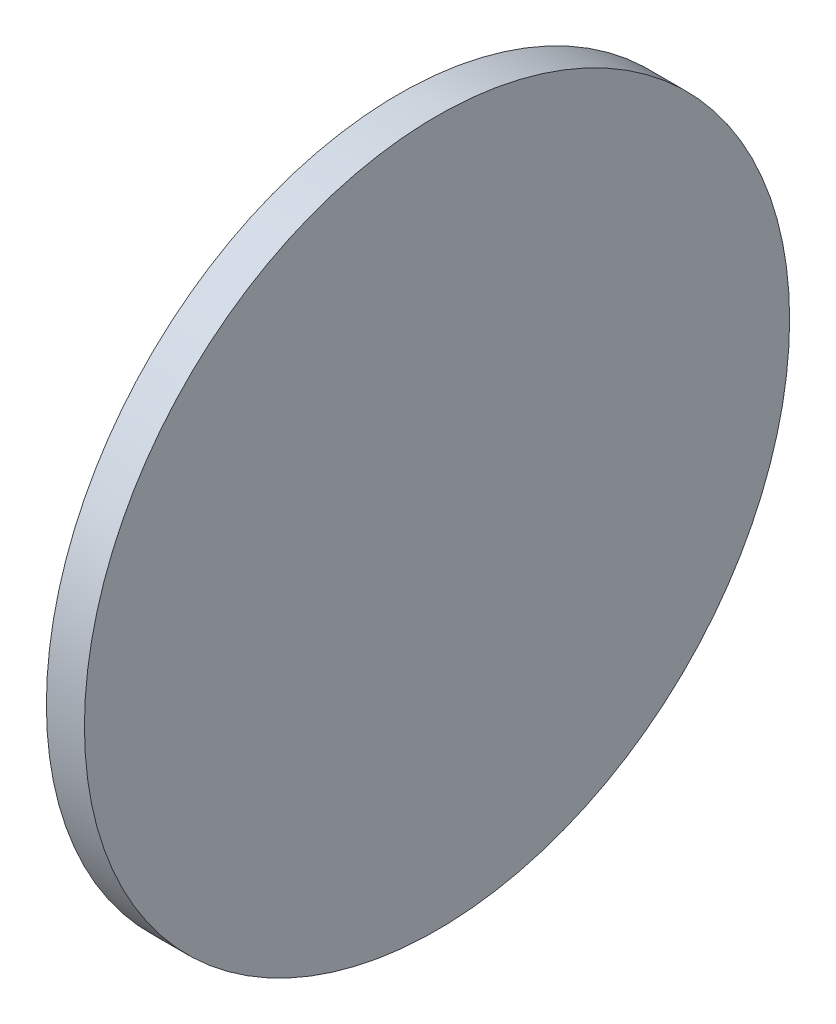
ISO-10303-21;
HEADER;
FILE_DESCRIPTION(('STEP AP214'),'2;1');
FILE_NAME('part.step','',(''),(''),'','','');
FILE_SCHEMA(('AUTOMOTIVE_DESIGN { 1 0 10303 214 1 1 1 1 }'));
ENDSEC;
DATA;
#1=APPLICATION_CONTEXT('core data for automotive mechanical design processes');
#2=APPLICATION_PROTOCOL_DEFINITION('international standard','automotive_design',2000,#1);
#3=PRODUCT_CONTEXT('',#1,'mechanical');
#4=PRODUCT('Part','Part','',(#3));
#5=PRODUCT_RELATED_PRODUCT_CATEGORY('part','',(#4));
#6=PRODUCT_DEFINITION_FORMATION('','',#4);
#7=PRODUCT_DEFINITION_CONTEXT('part definition',#1,'design');
#8=PRODUCT_DEFINITION('design','',#6,#7);
#9=PRODUCT_DEFINITION_SHAPE('','',#8);
#10=(LENGTH_UNIT() NAMED_UNIT(*) SI_UNIT(.MILLI.,.METRE.));
#11=(NAMED_UNIT(*) PLANE_ANGLE_UNIT() SI_UNIT($,.RADIAN.));
#12=(NAMED_UNIT(*) SI_UNIT($,.STERADIAN.) SOLID_ANGLE_UNIT());
#13=UNCERTAINTY_MEASURE_WITH_UNIT(LENGTH_MEASURE(1.E-05),#10,'distance_accuracy_value','');
#14=(GEOMETRIC_REPRESENTATION_CONTEXT(3) GLOBAL_UNCERTAINTY_ASSIGNED_CONTEXT((#13)) GLOBAL_UNIT_ASSIGNED_CONTEXT((#10,
#11,#12)) REPRESENTATION_CONTEXT('',''));
#15=CARTESIAN_POINT('',(0.,0.,0.));
#16=DIRECTION('',(0.,0.,1.));
#17=DIRECTION('',(1.,0.,0.));
#18=AXIS2_PLACEMENT_3D('',#15,#16,#17);
#19=CARTESIAN_POINT('',(0.,0.,0.));
#20=DIRECTION('',(1.,0.,0.));
#21=DIRECTION('',(0.,0.,-1.));
#22=AXIS2_PLACEMENT_3D('',#19,#20,#21);
#23=PLANE('',#22);
#24=CARTESIAN_POINT('',(0.,0.,0.));
#25=DIRECTION('',(-1.,0.,0.));
#26=DIRECTION('',(0.,0.,1.));
#27=AXIS2_PLACEMENT_3D('',#24,#25,#26);
#28=CIRCLE('',#27,5.);
#29=CARTESIAN_POINT('',(0.,0.,5.));
#30=VERTEX_POINT('',#29);
#31=EDGE_CURVE('E10',#30,#30,#28,.T.);
#32=ORIENTED_EDGE('',*,*,#31,.T.);
#33=EDGE_LOOP('',(#32));
#34=FACE_BOUND('',#33,.T.);
#35=ADVANCED_FACE('F34',(#34),#23,.F.);
#36=CARTESIAN_POINT('',(0.,0.,0.));
#37=DIRECTION('',(-1.,0.,0.));
#38=DIRECTION('',(0.,0.,1.));
#39=AXIS2_PLACEMENT_3D('',#36,#37,#38);
#40=CYLINDRICAL_SURFACE('',#39,5.);
#41=ORIENTED_EDGE('',*,*,#31,.F.);
#42=EDGE_LOOP('',(#41));
#43=FACE_BOUND('',#42,.T.);
#44=CARTESIAN_POINT('',(0.5,0.,0.));
#45=DIRECTION('',(-1.,0.,0.));
#46=DIRECTION('',(0.,0.,1.));
#47=AXIS2_PLACEMENT_3D('',#44,#45,#46);
#48=CIRCLE('',#47,5.);
#49=CARTESIAN_POINT('',(0.5,0.,5.));
#50=VERTEX_POINT('',#49);
#51=EDGE_CURVE('E40',#50,#50,#48,.T.);
#52=ORIENTED_EDGE('',*,*,#51,.T.);
#53=EDGE_LOOP('',(#52));
#54=FACE_BOUND('',#53,.T.);
#55=ADVANCED_FACE('F66',(#43,#54),#40,.T.);
#56=CARTESIAN_POINT('',(0.5,5.,0.));
#57=DIRECTION('',(1.,0.,0.));
#58=DIRECTION('',(0.,0.,-1.));
#59=AXIS2_PLACEMENT_3D('',#56,#57,#58);
#60=PLANE('',#59);
#61=ORIENTED_EDGE('',*,*,#51,.F.);
#62=EDGE_LOOP('',(#61));
#63=FACE_BOUND('',#62,.T.);
#64=CARTESIAN_POINT('',(0.5,0.,0.));
#65=DIRECTION('',(-1.,0.,0.));
#66=DIRECTION('',(0.,0.,1.));
#67=AXIS2_PLACEMENT_3D('',#64,#65,#66);
#68=CIRCLE('',#67,13.9);
#69=CARTESIAN_POINT('',(0.5,0.,13.9));
#70=VERTEX_POINT('',#69);
#71=EDGE_CURVE('E44',#70,#70,#68,.T.);
#72=ORIENTED_EDGE('',*,*,#71,.T.);
#73=EDGE_LOOP('',(#72));
#74=FACE_BOUND('',#73,.T.);
#75=ADVANCED_FACE('F62',(#63,#74),#60,.F.);
#76=CARTESIAN_POINT('',(0.,0.,0.));
#77=DIRECTION('',(-1.,0.,0.));
#78=DIRECTION('',(0.,0.,1.));
#79=AXIS2_PLACEMENT_3D('',#76,#77,#78);
#80=CYLINDRICAL_SURFACE('',#79,13.9);
#81=ORIENTED_EDGE('',*,*,#71,.F.);
#82=EDGE_LOOP('',(#81));
#83=FACE_BOUND('',#82,.T.);
#84=CARTESIAN_POINT('',(2.,0.,0.));
#85=DIRECTION('',(-1.,0.,0.));
#86=DIRECTION('',(0.,0.,1.));
#87=AXIS2_PLACEMENT_3D('',#84,#85,#86);
#88=CIRCLE('',#87,13.9);
#89=CARTESIAN_POINT('',(2.,0.,13.9));
#90=VERTEX_POINT('',#89);
#91=EDGE_CURVE('E48',#90,#90,#88,.T.);
#92=ORIENTED_EDGE('',*,*,#91,.T.);
#93=EDGE_LOOP('',(#92));
#94=FACE_BOUND('',#93,.T.);
#95=ADVANCED_FACE('F54',(#83,#94),#80,.T.);
#96=CARTESIAN_POINT('',(2.,13.9,0.));
#97=DIRECTION('',(-1.,0.,0.));
#98=DIRECTION('',(0.,0.,1.));
#99=AXIS2_PLACEMENT_3D('',#96,#97,#98);
#100=PLANE('',#99);
#101=ORIENTED_EDGE('',*,*,#91,.F.);
#102=EDGE_LOOP('',(#101));
#103=FACE_BOUND('',#102,.T.);
#104=ADVANCED_FACE('F56',(#103),#100,.F.);
#105=CLOSED_SHELL('',(#35,#55,#75,#95,#104));
#106=MANIFOLD_SOLID_BREP('B2',#105);
#107=ADVANCED_BREP_SHAPE_REPRESENTATION('',(#18,#106),#14);
#108=SHAPE_DEFINITION_REPRESENTATION(#9,#107);
ENDSEC;
END-ISO-10303-21;
